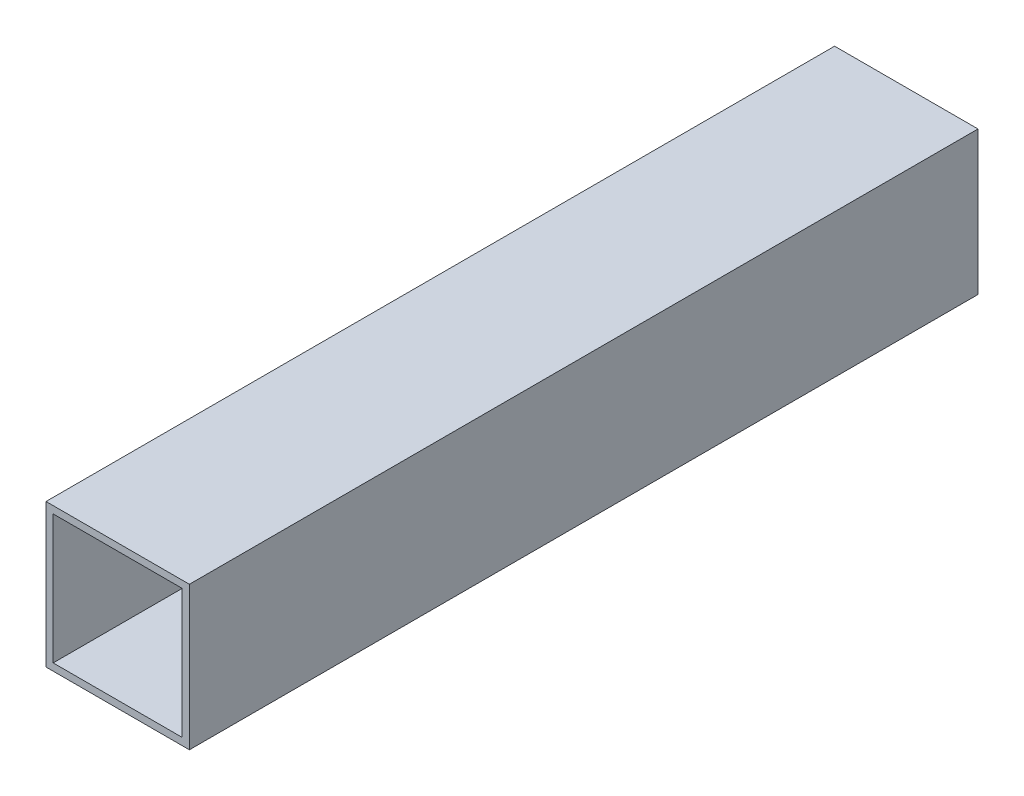
ISO-10303-21;
HEADER;
FILE_DESCRIPTION(('STEP AP214'),'2;1');
FILE_NAME('part.step','',(''),(''),'','','');
FILE_SCHEMA(('AUTOMOTIVE_DESIGN { 1 0 10303 214 1 1 1 1 }'));
ENDSEC;
DATA;
#1=APPLICATION_CONTEXT('core data for automotive mechanical design processes');
#2=APPLICATION_PROTOCOL_DEFINITION('international standard','automotive_design',2000,#1);
#3=PRODUCT_CONTEXT('',#1,'mechanical');
#4=PRODUCT('Part','Part','',(#3));
#5=PRODUCT_RELATED_PRODUCT_CATEGORY('part','',(#4));
#6=PRODUCT_DEFINITION_FORMATION('','',#4);
#7=PRODUCT_DEFINITION_CONTEXT('part definition',#1,'design');
#8=PRODUCT_DEFINITION('design','',#6,#7);
#9=PRODUCT_DEFINITION_SHAPE('','',#8);
#10=(LENGTH_UNIT() NAMED_UNIT(*) SI_UNIT(.MILLI.,.METRE.));
#11=(NAMED_UNIT(*) PLANE_ANGLE_UNIT() SI_UNIT($,.RADIAN.));
#12=(NAMED_UNIT(*) SI_UNIT($,.STERADIAN.) SOLID_ANGLE_UNIT());
#13=UNCERTAINTY_MEASURE_WITH_UNIT(LENGTH_MEASURE(1.E-05),#10,'distance_accuracy_value','');
#14=(GEOMETRIC_REPRESENTATION_CONTEXT(3) GLOBAL_UNCERTAINTY_ASSIGNED_CONTEXT((#13)) GLOBAL_UNIT_ASSIGNED_CONTEXT((#10,
#11,#12)) REPRESENTATION_CONTEXT('',''));
#15=CARTESIAN_POINT('',(0.,0.,0.));
#16=DIRECTION('',(0.,0.,1.));
#17=DIRECTION('',(1.,0.,0.));
#18=AXIS2_PLACEMENT_3D('',#15,#16,#17);
#19=CARTESIAN_POINT('',(-20.,-20.,-1320.));
#20=DIRECTION('',(0.,0.,-1.));
#21=DIRECTION('',(1.,0.,0.));
#22=AXIS2_PLACEMENT_3D('',#19,#20,#21);
#23=PLANE('',#22);
#24=DIRECTION('',(0.,-1.,0.));
#25=VECTOR('',#24,1.);
#26=CARTESIAN_POINT('',(-20.,-20.,-1320.));
#27=LINE('',#26,#25);
#28=CARTESIAN_POINT('',(-20.,20.,-1320.));
#29=VERTEX_POINT('',#28);
#30=CARTESIAN_POINT('',(-20.,-20.,-1320.));
#31=VERTEX_POINT('',#30);
#32=EDGE_CURVE('E129',#29,#31,#27,.T.);
#33=ORIENTED_EDGE('',*,*,#32,.F.);
#34=DIRECTION('',(-1.,0.,0.));
#35=VECTOR('',#34,1.);
#36=CARTESIAN_POINT('',(20.,20.,-1320.));
#37=LINE('',#36,#35);
#38=CARTESIAN_POINT('',(20.,20.,-1320.));
#39=VERTEX_POINT('',#38);
#40=EDGE_CURVE('E139',#39,#29,#37,.T.);
#41=ORIENTED_EDGE('',*,*,#40,.F.);
#42=DIRECTION('',(0.,1.,0.));
#43=VECTOR('',#42,1.);
#44=CARTESIAN_POINT('',(20.,-20.,-1320.));
#45=LINE('',#44,#43);
#46=CARTESIAN_POINT('',(20.,-20.,-1320.));
#47=VERTEX_POINT('',#46);
#48=EDGE_CURVE('E136',#47,#39,#45,.T.);
#49=ORIENTED_EDGE('',*,*,#48,.F.);
#50=DIRECTION('',(1.,0.,0.));
#51=VECTOR('',#50,1.);
#52=CARTESIAN_POINT('',(20.,-20.,-1320.));
#53=LINE('',#52,#51);
#54=EDGE_CURVE('E132',#31,#47,#53,.T.);
#55=ORIENTED_EDGE('',*,*,#54,.F.);
#56=EDGE_LOOP('',(#33,#41,#49,#55));
#57=FACE_BOUND('',#56,.T.);
#58=DIRECTION('',(1.,0.,0.));
#59=VECTOR('',#58,1.);
#60=CARTESIAN_POINT('',(20.,-18.,-1320.));
#61=LINE('',#60,#59);
#62=CARTESIAN_POINT('',(-18.,-18.,-1320.));
#63=VERTEX_POINT('',#62);
#64=CARTESIAN_POINT('',(18.,-18.,-1320.));
#65=VERTEX_POINT('',#64);
#66=EDGE_CURVE('E110',#63,#65,#61,.T.);
#67=ORIENTED_EDGE('',*,*,#66,.T.);
#68=DIRECTION('',(0.,1.,0.));
#69=VECTOR('',#68,1.);
#70=CARTESIAN_POINT('',(18.,-20.,-1320.));
#71=LINE('',#70,#69);
#72=CARTESIAN_POINT('',(18.,18.,-1320.));
#73=VERTEX_POINT('',#72);
#74=EDGE_CURVE('E115',#65,#73,#71,.T.);
#75=ORIENTED_EDGE('',*,*,#74,.T.);
#76=DIRECTION('',(-1.,0.,0.));
#77=VECTOR('',#76,1.);
#78=CARTESIAN_POINT('',(20.,18.,-1320.));
#79=LINE('',#78,#77);
#80=CARTESIAN_POINT('',(-18.,18.,-1320.));
#81=VERTEX_POINT('',#80);
#82=EDGE_CURVE('E111',#73,#81,#79,.T.);
#83=ORIENTED_EDGE('',*,*,#82,.T.);
#84=DIRECTION('',(0.,-1.,0.));
#85=VECTOR('',#84,1.);
#86=CARTESIAN_POINT('',(-18.,-20.,-1320.));
#87=LINE('',#86,#85);
#88=EDGE_CURVE('E96',#81,#63,#87,.T.);
#89=ORIENTED_EDGE('',*,*,#88,.T.);
#90=EDGE_LOOP('',(#67,#75,#83,#89));
#91=FACE_BOUND('',#90,.T.);
#92=ADVANCED_FACE('F30',(#57,#91),#23,.T.);
#93=CARTESIAN_POINT('',(-20.,-20.,-1100.));
#94=DIRECTION('',(0.,0.,-1.));
#95=DIRECTION('',(1.,0.,0.));
#96=AXIS2_PLACEMENT_3D('',#93,#94,#95);
#97=PLANE('',#96);
#98=DIRECTION('',(0.,-1.,0.));
#99=VECTOR('',#98,1.);
#100=CARTESIAN_POINT('',(-20.,-20.,-1100.));
#101=LINE('',#100,#99);
#102=CARTESIAN_POINT('',(-20.,20.,-1100.));
#103=VERTEX_POINT('',#102);
#104=CARTESIAN_POINT('',(-20.,-20.,-1100.));
#105=VERTEX_POINT('',#104);
#106=EDGE_CURVE('E104',#103,#105,#101,.T.);
#107=ORIENTED_EDGE('',*,*,#106,.T.);
#108=DIRECTION('',(1.,0.,0.));
#109=VECTOR('',#108,1.);
#110=CARTESIAN_POINT('',(20.,-20.,-1100.));
#111=LINE('',#110,#109);
#112=CARTESIAN_POINT('',(20.,-20.,-1100.));
#113=VERTEX_POINT('',#112);
#114=EDGE_CURVE('E145',#105,#113,#111,.T.);
#115=ORIENTED_EDGE('',*,*,#114,.T.);
#116=DIRECTION('',(0.,1.,0.));
#117=VECTOR('',#116,1.);
#118=CARTESIAN_POINT('',(20.,-20.,-1100.));
#119=LINE('',#118,#117);
#120=CARTESIAN_POINT('',(20.,20.,-1100.));
#121=VERTEX_POINT('',#120);
#122=EDGE_CURVE('E148',#113,#121,#119,.T.);
#123=ORIENTED_EDGE('',*,*,#122,.T.);
#124=DIRECTION('',(-1.,0.,0.));
#125=VECTOR('',#124,1.);
#126=CARTESIAN_POINT('',(20.,20.,-1100.));
#127=LINE('',#126,#125);
#128=EDGE_CURVE('E133',#121,#103,#127,.T.);
#129=ORIENTED_EDGE('',*,*,#128,.T.);
#130=EDGE_LOOP('',(#107,#115,#123,#129));
#131=FACE_BOUND('',#130,.T.);
#132=DIRECTION('',(0.,-1.,0.));
#133=VECTOR('',#132,1.);
#134=CARTESIAN_POINT('',(-18.,-20.,-1100.));
#135=LINE('',#134,#133);
#136=CARTESIAN_POINT('',(-18.,18.,-1100.));
#137=VERTEX_POINT('',#136);
#138=CARTESIAN_POINT('',(-18.,-18.,-1100.));
#139=VERTEX_POINT('',#138);
#140=EDGE_CURVE('E99',#137,#139,#135,.T.);
#141=ORIENTED_EDGE('',*,*,#140,.F.);
#142=DIRECTION('',(-1.,0.,0.));
#143=VECTOR('',#142,1.);
#144=CARTESIAN_POINT('',(20.,18.,-1100.));
#145=LINE('',#144,#143);
#146=CARTESIAN_POINT('',(18.,18.,-1100.));
#147=VERTEX_POINT('',#146);
#148=EDGE_CURVE('E112',#147,#137,#145,.T.);
#149=ORIENTED_EDGE('',*,*,#148,.F.);
#150=DIRECTION('',(0.,1.,0.));
#151=VECTOR('',#150,1.);
#152=CARTESIAN_POINT('',(18.,-20.,-1100.));
#153=LINE('',#152,#151);
#154=CARTESIAN_POINT('',(18.,-18.,-1100.));
#155=VERTEX_POINT('',#154);
#156=EDGE_CURVE('E123',#155,#147,#153,.T.);
#157=ORIENTED_EDGE('',*,*,#156,.F.);
#158=DIRECTION('',(1.,0.,0.));
#159=VECTOR('',#158,1.);
#160=CARTESIAN_POINT('',(20.,-18.,-1100.));
#161=LINE('',#160,#159);
#162=EDGE_CURVE('E121',#139,#155,#161,.T.);
#163=ORIENTED_EDGE('',*,*,#162,.F.);
#164=EDGE_LOOP('',(#141,#149,#157,#163));
#165=FACE_BOUND('',#164,.T.);
#166=ADVANCED_FACE('F165',(#131,#165),#97,.F.);
#167=CARTESIAN_POINT('',(-20.,-20.,-1320.));
#168=DIRECTION('',(1.,0.,0.));
#169=DIRECTION('',(0.,0.,1.));
#170=AXIS2_PLACEMENT_3D('',#167,#168,#169);
#171=PLANE('',#170);
#172=ORIENTED_EDGE('',*,*,#106,.F.);
#173=DIRECTION('',(0.,0.,1.));
#174=VECTOR('',#173,1.);
#175=CARTESIAN_POINT('',(-20.,20.,-1320.));
#176=LINE('',#175,#174);
#177=EDGE_CURVE('E142',#29,#103,#176,.T.);
#178=ORIENTED_EDGE('',*,*,#177,.F.);
#179=ORIENTED_EDGE('',*,*,#32,.T.);
#180=DIRECTION('',(0.,0.,1.));
#181=VECTOR('',#180,1.);
#182=CARTESIAN_POINT('',(-20.,-20.,-1320.));
#183=LINE('',#182,#181);
#184=EDGE_CURVE('E11',#31,#105,#183,.T.);
#185=ORIENTED_EDGE('',*,*,#184,.T.);
#186=EDGE_LOOP('',(#172,#178,#179,#185));
#187=FACE_BOUND('',#186,.T.);
#188=ADVANCED_FACE('F32',(#187),#171,.F.);
#189=CARTESIAN_POINT('',(20.,-20.,-1320.));
#190=DIRECTION('',(0.,1.,0.));
#191=DIRECTION('',(-1.,0.,0.));
#192=AXIS2_PLACEMENT_3D('',#189,#190,#191);
#193=PLANE('',#192);
#194=ORIENTED_EDGE('',*,*,#114,.F.);
#195=ORIENTED_EDGE('',*,*,#184,.F.);
#196=ORIENTED_EDGE('',*,*,#54,.T.);
#197=DIRECTION('',(0.,0.,1.));
#198=VECTOR('',#197,1.);
#199=CARTESIAN_POINT('',(20.,-20.,-1320.));
#200=LINE('',#199,#198);
#201=EDGE_CURVE('E38',#47,#113,#200,.T.);
#202=ORIENTED_EDGE('',*,*,#201,.T.);
#203=EDGE_LOOP('',(#194,#195,#196,#202));
#204=FACE_BOUND('',#203,.T.);
#205=ADVANCED_FACE('F158',(#204),#193,.F.);
#206=CARTESIAN_POINT('',(20.,-20.,-1320.));
#207=DIRECTION('',(-1.,0.,0.));
#208=DIRECTION('',(0.,0.,-1.));
#209=AXIS2_PLACEMENT_3D('',#206,#207,#208);
#210=PLANE('',#209);
#211=ORIENTED_EDGE('',*,*,#122,.F.);
#212=ORIENTED_EDGE('',*,*,#201,.F.);
#213=ORIENTED_EDGE('',*,*,#48,.T.);
#214=DIRECTION('',(0.,0.,1.));
#215=VECTOR('',#214,1.);
#216=CARTESIAN_POINT('',(20.,20.,-1320.));
#217=LINE('',#216,#215);
#218=EDGE_CURVE('E154',#39,#121,#217,.T.);
#219=ORIENTED_EDGE('',*,*,#218,.T.);
#220=EDGE_LOOP('',(#211,#212,#213,#219));
#221=FACE_BOUND('',#220,.T.);
#222=ADVANCED_FACE('F162',(#221),#210,.F.);
#223=CARTESIAN_POINT('',(20.,20.,-1320.));
#224=DIRECTION('',(0.,-1.,0.));
#225=DIRECTION('',(1.,0.,0.));
#226=AXIS2_PLACEMENT_3D('',#223,#224,#225);
#227=PLANE('',#226);
#228=ORIENTED_EDGE('',*,*,#128,.F.);
#229=ORIENTED_EDGE('',*,*,#218,.F.);
#230=ORIENTED_EDGE('',*,*,#40,.T.);
#231=ORIENTED_EDGE('',*,*,#177,.T.);
#232=EDGE_LOOP('',(#228,#229,#230,#231));
#233=FACE_BOUND('',#232,.T.);
#234=ADVANCED_FACE('F173',(#233),#227,.F.);
#235=CARTESIAN_POINT('',(-18.,-20.,-1320.));
#236=DIRECTION('',(1.,0.,0.));
#237=DIRECTION('',(0.,0.,1.));
#238=AXIS2_PLACEMENT_3D('',#235,#236,#237);
#239=PLANE('',#238);
#240=ORIENTED_EDGE('',*,*,#140,.T.);
#241=DIRECTION('',(0.,0.,1.));
#242=VECTOR('',#241,1.);
#243=CARTESIAN_POINT('',(-18.,-18.,-1320.));
#244=LINE('',#243,#242);
#245=EDGE_CURVE('E93',#63,#139,#244,.T.);
#246=ORIENTED_EDGE('',*,*,#245,.F.);
#247=ORIENTED_EDGE('',*,*,#88,.F.);
#248=DIRECTION('',(0.,0.,1.));
#249=VECTOR('',#248,1.);
#250=CARTESIAN_POINT('',(-18.,18.,-1320.));
#251=LINE('',#250,#249);
#252=EDGE_CURVE('E53',#81,#137,#251,.T.);
#253=ORIENTED_EDGE('',*,*,#252,.T.);
#254=EDGE_LOOP('',(#240,#246,#247,#253));
#255=FACE_BOUND('',#254,.T.);
#256=ADVANCED_FACE('F95',(#255),#239,.T.);
#257=CARTESIAN_POINT('',(20.,-18.,-1320.));
#258=DIRECTION('',(0.,1.,0.));
#259=DIRECTION('',(-1.,0.,0.));
#260=AXIS2_PLACEMENT_3D('',#257,#258,#259);
#261=PLANE('',#260);
#262=ORIENTED_EDGE('',*,*,#162,.T.);
#263=DIRECTION('',(0.,0.,1.));
#264=VECTOR('',#263,1.);
#265=CARTESIAN_POINT('',(18.,-18.,-1320.));
#266=LINE('',#265,#264);
#267=EDGE_CURVE('E105',#65,#155,#266,.T.);
#268=ORIENTED_EDGE('',*,*,#267,.F.);
#269=ORIENTED_EDGE('',*,*,#66,.F.);
#270=ORIENTED_EDGE('',*,*,#245,.T.);
#271=EDGE_LOOP('',(#262,#268,#269,#270));
#272=FACE_BOUND('',#271,.T.);
#273=ADVANCED_FACE('F114',(#272),#261,.T.);
#274=CARTESIAN_POINT('',(18.,-20.,-1320.));
#275=DIRECTION('',(-1.,0.,0.));
#276=DIRECTION('',(0.,0.,-1.));
#277=AXIS2_PLACEMENT_3D('',#274,#275,#276);
#278=PLANE('',#277);
#279=ORIENTED_EDGE('',*,*,#156,.T.);
#280=DIRECTION('',(0.,0.,1.));
#281=VECTOR('',#280,1.);
#282=CARTESIAN_POINT('',(18.,18.,-1320.));
#283=LINE('',#282,#281);
#284=EDGE_CURVE('E45',#73,#147,#283,.T.);
#285=ORIENTED_EDGE('',*,*,#284,.F.);
#286=ORIENTED_EDGE('',*,*,#74,.F.);
#287=ORIENTED_EDGE('',*,*,#267,.T.);
#288=EDGE_LOOP('',(#279,#285,#286,#287));
#289=FACE_BOUND('',#288,.T.);
#290=ADVANCED_FACE('F191',(#289),#278,.T.);
#291=CARTESIAN_POINT('',(20.,18.,-1320.));
#292=DIRECTION('',(0.,-1.,0.));
#293=DIRECTION('',(1.,0.,0.));
#294=AXIS2_PLACEMENT_3D('',#291,#292,#293);
#295=PLANE('',#294);
#296=ORIENTED_EDGE('',*,*,#148,.T.);
#297=ORIENTED_EDGE('',*,*,#252,.F.);
#298=ORIENTED_EDGE('',*,*,#82,.F.);
#299=ORIENTED_EDGE('',*,*,#284,.T.);
#300=EDGE_LOOP('',(#296,#297,#298,#299));
#301=FACE_BOUND('',#300,.T.);
#302=ADVANCED_FACE('F194',(#301),#295,.T.);
#303=CLOSED_SHELL('',(#92,#166,#188,#205,#222,#234,#256,#273,#290,#302));
#304=MANIFOLD_SOLID_BREP('B2',#303);
#305=ADVANCED_BREP_SHAPE_REPRESENTATION('',(#18,#304),#14);
#306=SHAPE_DEFINITION_REPRESENTATION(#9,#305);
ENDSEC;
END-ISO-10303-21;
